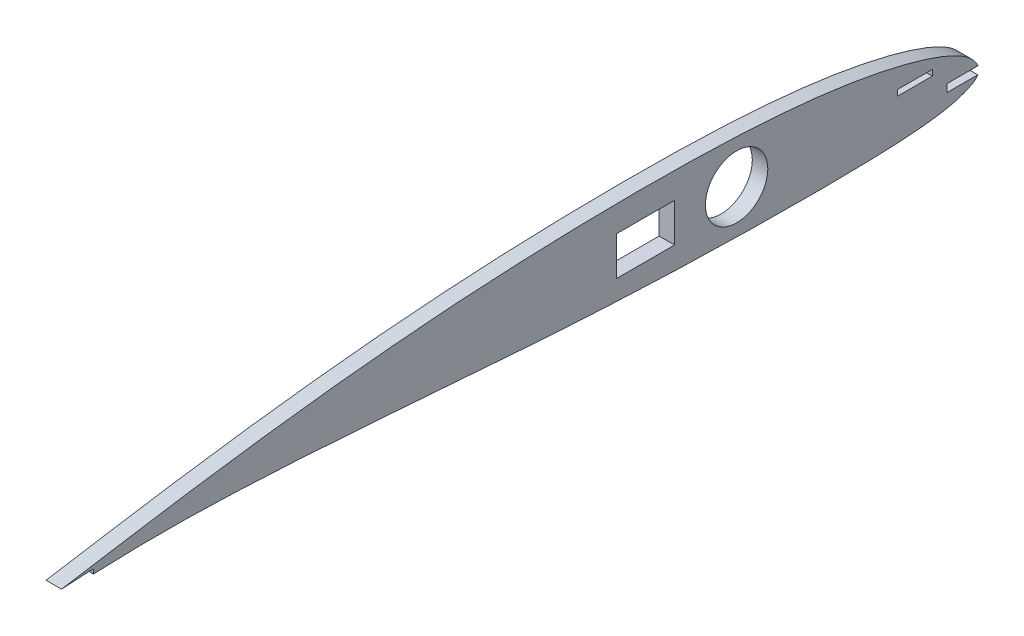
ISO-10303-21;
HEADER;
FILE_DESCRIPTION(('STEP AP214'),'2;1');
FILE_NAME('part.step','',(''),(''),'','','');
FILE_SCHEMA(('AUTOMOTIVE_DESIGN { 1 0 10303 214 1 1 1 1 }'));
ENDSEC;
DATA;
#1=APPLICATION_CONTEXT('core data for automotive mechanical design processes');
#2=APPLICATION_PROTOCOL_DEFINITION('international standard','automotive_design',2000,#1);
#3=PRODUCT_CONTEXT('',#1,'mechanical');
#4=PRODUCT('Part','Part','',(#3));
#5=PRODUCT_RELATED_PRODUCT_CATEGORY('part','',(#4));
#6=PRODUCT_DEFINITION_FORMATION('','',#4);
#7=PRODUCT_DEFINITION_CONTEXT('part definition',#1,'design');
#8=PRODUCT_DEFINITION('design','',#6,#7);
#9=PRODUCT_DEFINITION_SHAPE('','',#8);
#10=(LENGTH_UNIT() NAMED_UNIT(*) SI_UNIT(.MILLI.,.METRE.));
#11=(NAMED_UNIT(*) PLANE_ANGLE_UNIT() SI_UNIT($,.RADIAN.));
#12=(NAMED_UNIT(*) SI_UNIT($,.STERADIAN.) SOLID_ANGLE_UNIT());
#13=UNCERTAINTY_MEASURE_WITH_UNIT(LENGTH_MEASURE(1.E-05),#10,'distance_accuracy_value','');
#14=(GEOMETRIC_REPRESENTATION_CONTEXT(3) GLOBAL_UNCERTAINTY_ASSIGNED_CONTEXT((#13)) GLOBAL_UNIT_ASSIGNED_CONTEXT((#10,
#11,#12)) REPRESENTATION_CONTEXT('',''));
#15=CARTESIAN_POINT('',(0.,0.,0.));
#16=DIRECTION('',(0.,0.,1.));
#17=DIRECTION('',(1.,0.,0.));
#18=AXIS2_PLACEMENT_3D('',#15,#16,#17);
#19=CARTESIAN_POINT('',(4.,1.49711132773622,0.435092083404368));
#20=DIRECTION('',(-1.,0.,0.));
#21=DIRECTION('',(0.,0.,1.));
#22=AXIS2_PLACEMENT_3D('',#19,#20,#21);
#23=PLANE('',#22);
#24=DIRECTION('',(0.,1.,0.));
#25=VECTOR('',#24,1.);
#26=CARTESIAN_POINT('',(4.,10.0773227037384,78.4999197093942));
#27=LINE('',#26,#25);
#28=CARTESIAN_POINT('',(4.,0.0773227037384437,78.4999197093942));
#29=VERTEX_POINT('',#28);
#30=CARTESIAN_POINT('',(4.,10.0773227037384,78.4999197093942));
#31=VERTEX_POINT('',#30);
#32=EDGE_CURVE('E255',#29,#31,#27,.T.);
#33=ORIENTED_EDGE('',*,*,#32,.F.);
#34=DIRECTION('',(0.,0.,-1.));
#35=VECTOR('',#34,1.);
#36=CARTESIAN_POINT('',(4.,0.0773227037384437,78.4999197093942));
#37=LINE('',#36,#35);
#38=CARTESIAN_POINT('',(4.,0.0773227037384437,93.4999197093942));
#39=VERTEX_POINT('',#38);
#40=EDGE_CURVE('E266',#39,#29,#37,.T.);
#41=ORIENTED_EDGE('',*,*,#40,.F.);
#42=DIRECTION('',(0.,-1.,0.));
#43=VECTOR('',#42,1.);
#44=CARTESIAN_POINT('',(4.,10.0773227037384,93.4999197093942));
#45=LINE('',#44,#43);
#46=CARTESIAN_POINT('',(4.,10.0773227037384,93.4999197093942));
#47=VERTEX_POINT('',#46);
#48=EDGE_CURVE('E262',#47,#39,#45,.T.);
#49=ORIENTED_EDGE('',*,*,#48,.F.);
#50=DIRECTION('',(0.,0.,1.));
#51=VECTOR('',#50,1.);
#52=CARTESIAN_POINT('',(4.,10.0773227037384,78.4999197093942));
#53=LINE('',#52,#51);
#54=EDGE_CURVE('E258',#31,#47,#53,.T.);
#55=ORIENTED_EDGE('',*,*,#54,.F.);
#56=EDGE_LOOP('',(#33,#41,#49,#55));
#57=FACE_BOUND('',#56,.T.);
#58=CARTESIAN_POINT('',(4.,5.07732270373844,62.4999197093942));
#59=DIRECTION('',(1.,0.,0.));
#60=DIRECTION('',(0.,0.,-1.));
#61=AXIS2_PLACEMENT_3D('',#58,#59,#60);
#62=CIRCLE('',#61,8.05);
#63=CARTESIAN_POINT('',(4.,5.07732270373844,54.4499197093942));
#64=VERTEX_POINT('',#63);
#65=EDGE_CURVE('E203',#64,#64,#62,.T.);
#66=ORIENTED_EDGE('',*,*,#65,.F.);
#67=EDGE_LOOP('',(#66));
#68=FACE_BOUND('',#67,.T.);
#69=DIRECTION('',(0.,0.,1.));
#70=VECTOR('',#69,1.);
#71=CARTESIAN_POINT('',(4.,4.57732270373843,21.));
#72=LINE('',#71,#70);
#73=CARTESIAN_POINT('',(4.,4.57732270373843,12.));
#74=VERTEX_POINT('',#73);
#75=CARTESIAN_POINT('',(4.,4.57732270373843,21.));
#76=VERTEX_POINT('',#75);
#77=EDGE_CURVE('E335',#74,#76,#72,.T.);
#78=ORIENTED_EDGE('',*,*,#77,.T.);
#79=DIRECTION('',(0.,1.,0.));
#80=VECTOR('',#79,1.);
#81=CARTESIAN_POINT('',(4.,6.07732270373843,21.));
#82=LINE('',#81,#80);
#83=CARTESIAN_POINT('',(4.,6.07732270373843,21.));
#84=VERTEX_POINT('',#83);
#85=EDGE_CURVE('E338',#76,#84,#82,.T.);
#86=ORIENTED_EDGE('',*,*,#85,.T.);
#87=DIRECTION('',(0.,0.,-1.));
#88=VECTOR('',#87,1.);
#89=CARTESIAN_POINT('',(4.,6.07732270373843,21.));
#90=LINE('',#89,#88);
#91=CARTESIAN_POINT('',(4.,6.07732270373843,12.));
#92=VERTEX_POINT('',#91);
#93=EDGE_CURVE('E348',#84,#92,#90,.T.);
#94=ORIENTED_EDGE('',*,*,#93,.T.);
#95=DIRECTION('',(0.,-1.,0.));
#96=VECTOR('',#95,1.);
#97=CARTESIAN_POINT('',(4.,6.07732270373843,12.));
#98=LINE('',#97,#96);
#99=EDGE_CURVE('E88',#92,#74,#98,.T.);
#100=ORIENTED_EDGE('',*,*,#99,.T.);
#101=EDGE_LOOP('',(#78,#86,#94,#100));
#102=FACE_BOUND('',#101,.T.);
#103=DIRECTION('',(0.,0.998451108391885,0.0556361766390854));
#104=VECTOR('',#103,1.);
#105=CARTESIAN_POINT('',(4.,1.52622001669951,228.477241343692));
#106=LINE('',#105,#104);
#107=CARTESIAN_POINT('',(4.,1.52622001669951,228.477241343692));
#108=VERTEX_POINT('',#107);
#109=CARTESIAN_POINT('',(4.,2.72436134676977,228.544004755659));
#110=VERTEX_POINT('',#109);
#111=EDGE_CURVE('E194',#108,#110,#106,.T.);
#112=ORIENTED_EDGE('',*,*,#111,.F.);
#113=CARTESIAN_POINT('',(4.,0.,250.));
#114=CARTESIAN_POINT('',(4.,-0.0080427959719715,250.000228293678));
#115=CARTESIAN_POINT('',(4.,0.172375657967406,248.284955515532));
#116=CARTESIAN_POINT('',(4.,0.308690014795419,246.518112419387));
#117=CARTESIAN_POINT('',(4.,0.685693593852336,242.189387343398));
#118=CARTESIAN_POINT('',(4.,1.07410152891603,236.806461263496));
#119=CARTESIAN_POINT('',(4.,1.49731723995003,229.680385951639));
#120=CARTESIAN_POINT('',(4.,1.8232186026768,221.18415869828));
#121=CARTESIAN_POINT('',(4.,1.96762610068065,211.337618207726));
#122=CARTESIAN_POINT('',(4.,1.83322105638369,200.371188527109));
#123=CARTESIAN_POINT('',(4.,1.38960528984164,188.499913622482));
#124=CARTESIAN_POINT('',(4.,0.706014078000893,175.953687417433));
#125=CARTESIAN_POINT('',(4.,-0.160208641561513,162.931424917666));
#126=CARTESIAN_POINT('',(4.,-1.14801632724376,149.615771743617));
#127=CARTESIAN_POINT('',(4.,-2.19092490983926,136.176354994724));
#128=CARTESIAN_POINT('',(4.,-3.21958397917046,122.767140548026));
#129=CARTESIAN_POINT('',(4.,-4.15274312671142,109.520053587455));
#130=CARTESIAN_POINT('',(4.,-4.93856436487493,96.5460959745437));
#131=CARTESIAN_POINT('',(4.,-5.53683070268675,83.9408193016427));
#132=CARTESIAN_POINT('',(4.,-5.94764820461108,71.8018392906514));
#133=CARTESIAN_POINT('',(4.,-6.21845093878312,60.2452560030716));
#134=CARTESIAN_POINT('',(4.,-6.35536975583973,49.3987328907547));
#135=CARTESIAN_POINT('',(4.,-6.38138796281789,39.3972261942655));
#136=CARTESIAN_POINT('',(4.,-6.26504923032313,30.3619348419668));
#137=CARTESIAN_POINT('',(4.,-6.01216491688521,22.4121811031587));
#138=CARTESIAN_POINT('',(4.,-5.59743390072595,15.6262272306516));
#139=CARTESIAN_POINT('',(4.,-4.92870657935606,10.0719075109048));
#140=CARTESIAN_POINT('',(4.,-4.04044698146404,5.69769261214423));
#141=CARTESIAN_POINT('',(4.,-2.8657529844069,2.62532063874475));
#142=CARTESIAN_POINT('',(4.,-1.7115284699546,0.494884225045661));
#143=CARTESIAN_POINT('',(4.,-0.410454230626488,-0.0213125491030087));
#144=CARTESIAN_POINT('',(4.,0.792659826704065,0.0311691995850224));
#145=CARTESIAN_POINT('',(4.,2.30568433693192,0.812599241892923));
#146=CARTESIAN_POINT('',(4.,4.23835242447377,2.72886351673443));
#147=CARTESIAN_POINT('',(4.,6.11817212106947,5.76990724125498));
#148=CARTESIAN_POINT('',(4.,7.91359420170391,9.88094280419771));
#149=CARTESIAN_POINT('',(4.,9.64131817838287,15.0749304677094));
#150=CARTESIAN_POINT('',(4.,11.2838964878058,21.2987522216172));
#151=CARTESIAN_POINT('',(4.,12.7883817585812,28.4971721202648));
#152=CARTESIAN_POINT('',(4.,14.0978349081275,36.6073734062479));
#153=CARTESIAN_POINT('',(4.,15.1594290171638,45.573028440303));
#154=CARTESIAN_POINT('',(4.,15.9609039979753,55.3329100744701));
#155=CARTESIAN_POINT('',(4.,16.4940697383882,65.8165364983871));
#156=CARTESIAN_POINT('',(4.,16.7919897051422,76.9313762604552));
#157=CARTESIAN_POINT('',(4.,16.864754130909,88.5669490281142));
#158=CARTESIAN_POINT('',(4.,16.7267152914356,100.596999885542));
#159=CARTESIAN_POINT('',(4.,16.3833850637257,112.888825982424));
#160=CARTESIAN_POINT('',(4.,15.825573666627,125.31161581915));
#161=CARTESIAN_POINT('',(4.,15.0523318700684,137.743791097076));
#162=CARTESIAN_POINT('',(4.,14.0593390742259,150.072384382085));
#163=CARTESIAN_POINT('',(4.,12.8815869860292,162.191375055682));
#164=CARTESIAN_POINT('',(4.,11.5492803460744,173.989074322246));
#165=CARTESIAN_POINT('',(4.,10.1162497290333,185.35236444642));
#166=CARTESIAN_POINT('',(4.,8.63237912523508,196.163081697706));
#167=CARTESIAN_POINT('',(4.,7.13151388385034,206.300441402258));
#168=CARTESIAN_POINT('',(4.,5.73122176805054,215.560350587015));
#169=CARTESIAN_POINT('',(4.,4.29329512716244,223.97715704258));
#170=CARTESIAN_POINT('',(4.,3.1818088737293,231.363413336396));
#171=CARTESIAN_POINT('',(4.,2.09894241729889,237.746440904332));
#172=CARTESIAN_POINT('',(4.,1.2458619166603,242.622069365861));
#173=CARTESIAN_POINT('',(4.,0.552864946230777,246.64452933247));
#174=CARTESIAN_POINT('',(4.,0.246216764640028,248.328398440367));
#175=CARTESIAN_POINT('',(4.,0.00797737724443801,249.999773563223));
#176=CARTESIAN_POINT('',(4.,0.,250.));
#177=B_SPLINE_CURVE_WITH_KNOTS('',3,(#113,#114,#115,#116,#117,#118,#119,#120,#121,#122,#123,
#124,#125,#126,#127,#128,#129,#130,#131,#132,#133,#134,#135,#136,#137,#138,#139,#140,#141,#142,
#143,#144,#145,#146,#147,#148,#149,#150,#151,#152,#153,#154,#155,#156,#157,#158,#159,#160,#161,
#162,#163,#164,#165,#166,#167,#168,#169,#170,#171,#172,#173,#174,#175,#176),.UNSPECIFIED.,.T.,
.F.,(4,1,1,1,1,1,1,1,1,1,1,1,1,1,1,1,1,1,1,1,1,1,1,1,1,1,1,1,1,1,1,1,1,1,1,1,1,1,1,1,1,1,1,1,1,
1,1,1,1,1,1,1,1,1,1,1,1,1,1,1,1,4),(0.,0.00158888881614516,0.00632921783555629,
0.0142024564897436,0.0251728077530557,0.0391734833267743,0.0560606311759249,0.0755789238487882,
0.0973636066296903,0.120926258366677,0.145825281006277,0.171670911815127,0.198108536705041,
0.22479018357162,0.25139057978404,0.277643490654311,0.303326750051388,0.328257458029316,
0.352272548115194,0.375156061746876,0.396620664402003,0.416422729294005,0.434304420097656,
0.450054679859308,0.463465465082325,0.474478994238096,0.483169222153171,0.489678354497499,
0.494104066315722,0.496910015324886,0.497289784891853,0.501214273282496,0.506457950332762,
0.51335695674223,0.522168631834455,0.53296596992453,0.545689209241574,0.56022077890382,
0.57643892310517,0.594258689005965,0.613600244568652,0.634342385932902,0.656331109263004,
0.679351893859712,0.703152302846811,0.727478208080039,0.7520707394079,0.776691163534608,
0.801140183976245,0.825214386971546,0.848697423570622,0.871352857669295,0.892947448931157,
0.913230871058069,0.931955467148994,0.94834206907442,0.963693004275676,0.976235918239566,
0.986320058750392,0.993788799349345,0.998424034933867,1.),.UNSPECIFIED.);
#178=CARTESIAN_POINT('',(4.,-1.00000653516622,0.266538474913965));
#179=VERTEX_POINT('',#178);
#180=EDGE_CURVE('E197',#108,#179,#177,.T.);
#181=ORIENTED_EDGE('',*,*,#180,.T.);
#182=DIRECTION('',(0.,0.,1.));
#183=VECTOR('',#182,1.);
#184=CARTESIAN_POINT('',(4.,-1.00000652295607,-8.02951190162347E-05));
#185=LINE('',#184,#183);
#186=CARTESIAN_POINT('',(4.,-1.00000652295607,8.19991970488098));
#187=VERTEX_POINT('',#186);
#188=EDGE_CURVE('E237',#179,#187,#185,.T.);
#189=ORIENTED_EDGE('',*,*,#188,.T.);
#190=DIRECTION('',(0.,1.,0.));
#191=VECTOR('',#190,1.);
#192=CARTESIAN_POINT('',(4.,0.999993477043933,8.19991970488098));
#193=LINE('',#192,#191);
#194=CARTESIAN_POINT('',(4.,0.999993477043933,8.19991970488098));
#195=VERTEX_POINT('',#194);
#196=EDGE_CURVE('E227',#187,#195,#193,.T.);
#197=ORIENTED_EDGE('',*,*,#196,.T.);
#198=DIRECTION('',(0.,0.,-1.));
#199=VECTOR('',#198,1.);
#200=CARTESIAN_POINT('',(4.,0.999993477043928,-8.0295119016847E-05));
#201=LINE('',#200,#199);
#202=CARTESIAN_POINT('',(4.,0.999993477043928,0.201514144687533));
#203=VERTEX_POINT('',#202);
#204=EDGE_CURVE('E224',#195,#203,#201,.T.);
#205=ORIENTED_EDGE('',*,*,#204,.T.);
#206=CARTESIAN_POINT('',(4.,2.26814469832928,236.731303844473));
#207=VERTEX_POINT('',#206);
#208=EDGE_CURVE('E202',#203,#207,#177,.T.);
#209=ORIENTED_EDGE('',*,*,#208,.T.);
#210=DIRECTION('',(0.,-0.0556361766390854,0.998451108391885));
#211=VECTOR('',#210,1.);
#212=CARTESIAN_POINT('',(4.,2.72436134676977,228.544004755659));
#213=LINE('',#212,#211);
#214=EDGE_CURVE('E178',#110,#207,#213,.T.);
#215=ORIENTED_EDGE('',*,*,#214,.F.);
#216=EDGE_LOOP('',(#112,#181,#189,#197,#205,#209,#215));
#217=FACE_BOUND('',#216,.T.);
#218=ADVANCED_FACE('F63',(#57,#68,#102,#217),#23,.F.);
#219=CARTESIAN_POINT('',(0.,1.49711132773622,0.435092083404368));
#220=DIRECTION('',(-1.,0.,0.));
#221=DIRECTION('',(0.,0.,1.));
#222=AXIS2_PLACEMENT_3D('',#219,#220,#221);
#223=PLANE('',#222);
#224=DIRECTION('',(0.,1.,0.));
#225=VECTOR('',#224,1.);
#226=CARTESIAN_POINT('',(0.,6.07732270373843,21.));
#227=LINE('',#226,#225);
#228=CARTESIAN_POINT('',(0.,4.57732270373843,21.));
#229=VERTEX_POINT('',#228);
#230=CARTESIAN_POINT('',(0.,6.07732270373843,21.));
#231=VERTEX_POINT('',#230);
#232=EDGE_CURVE('E184',#229,#231,#227,.T.);
#233=ORIENTED_EDGE('',*,*,#232,.F.);
#234=DIRECTION('',(0.,0.,1.));
#235=VECTOR('',#234,1.);
#236=CARTESIAN_POINT('',(0.,4.57732270373843,21.));
#237=LINE('',#236,#235);
#238=CARTESIAN_POINT('',(0.,4.57732270373843,12.));
#239=VERTEX_POINT('',#238);
#240=EDGE_CURVE('E362',#239,#229,#237,.T.);
#241=ORIENTED_EDGE('',*,*,#240,.F.);
#242=DIRECTION('',(0.,-1.,0.));
#243=VECTOR('',#242,1.);
#244=CARTESIAN_POINT('',(0.,6.07732270373843,12.));
#245=LINE('',#244,#243);
#246=CARTESIAN_POINT('',(0.,6.07732270373843,12.));
#247=VERTEX_POINT('',#246);
#248=EDGE_CURVE('E358',#247,#239,#245,.T.);
#249=ORIENTED_EDGE('',*,*,#248,.F.);
#250=DIRECTION('',(0.,0.,-1.));
#251=VECTOR('',#250,1.);
#252=CARTESIAN_POINT('',(0.,6.07732270373843,21.));
#253=LINE('',#252,#251);
#254=EDGE_CURVE('E354',#231,#247,#253,.T.);
#255=ORIENTED_EDGE('',*,*,#254,.F.);
#256=EDGE_LOOP('',(#233,#241,#249,#255));
#257=FACE_BOUND('',#256,.T.);
#258=CARTESIAN_POINT('',(0.,5.07732270373844,62.4999197093942));
#259=DIRECTION('',(1.,0.,0.));
#260=DIRECTION('',(0.,0.,-1.));
#261=AXIS2_PLACEMENT_3D('',#258,#259,#260);
#262=CIRCLE('',#261,8.05);
#263=CARTESIAN_POINT('',(0.,5.07732270373844,54.4499197093942));
#264=VERTEX_POINT('',#263);
#265=EDGE_CURVE('E297',#264,#264,#262,.T.);
#266=ORIENTED_EDGE('',*,*,#265,.T.);
#267=EDGE_LOOP('',(#266));
#268=FACE_BOUND('',#267,.T.);
#269=DIRECTION('',(0.,0.,-1.));
#270=VECTOR('',#269,1.);
#271=CARTESIAN_POINT('',(0.,0.0773227037384437,78.4999197093942));
#272=LINE('',#271,#270);
#273=CARTESIAN_POINT('',(0.,0.0773227037384437,93.4999197093942));
#274=VERTEX_POINT('',#273);
#275=CARTESIAN_POINT('',(0.,0.0773227037384437,78.4999197093942));
#276=VERTEX_POINT('',#275);
#277=EDGE_CURVE('E259',#274,#276,#272,.T.);
#278=ORIENTED_EDGE('',*,*,#277,.T.);
#279=DIRECTION('',(0.,1.,0.));
#280=VECTOR('',#279,1.);
#281=CARTESIAN_POINT('',(0.,10.0773227037384,78.4999197093942));
#282=LINE('',#281,#280);
#283=CARTESIAN_POINT('',(0.,10.0773227037384,78.4999197093942));
#284=VERTEX_POINT('',#283);
#285=EDGE_CURVE('E253',#276,#284,#282,.T.);
#286=ORIENTED_EDGE('',*,*,#285,.T.);
#287=DIRECTION('',(0.,0.,1.));
#288=VECTOR('',#287,1.);
#289=CARTESIAN_POINT('',(0.,10.0773227037384,78.4999197093942));
#290=LINE('',#289,#288);
#291=CARTESIAN_POINT('',(0.,10.0773227037384,93.4999197093942));
#292=VERTEX_POINT('',#291);
#293=EDGE_CURVE('E273',#284,#292,#290,.T.);
#294=ORIENTED_EDGE('',*,*,#293,.T.);
#295=DIRECTION('',(0.,-1.,0.));
#296=VECTOR('',#295,1.);
#297=CARTESIAN_POINT('',(0.,10.0773227037384,93.4999197093942));
#298=LINE('',#297,#296);
#299=EDGE_CURVE('E277',#292,#274,#298,.T.);
#300=ORIENTED_EDGE('',*,*,#299,.T.);
#301=EDGE_LOOP('',(#278,#286,#294,#300));
#302=FACE_BOUND('',#301,.T.);
#303=CARTESIAN_POINT('',(0.,0.,250.));
#304=CARTESIAN_POINT('',(0.,-0.0080427959719715,250.000228293678));
#305=CARTESIAN_POINT('',(0.,0.172375657967406,248.284955515532));
#306=CARTESIAN_POINT('',(0.,0.308690014795419,246.518112419387));
#307=CARTESIAN_POINT('',(0.,0.685693593852336,242.189387343398));
#308=CARTESIAN_POINT('',(0.,1.07410152891603,236.806461263496));
#309=CARTESIAN_POINT('',(0.,1.49731723995003,229.680385951639));
#310=CARTESIAN_POINT('',(0.,1.8232186026768,221.18415869828));
#311=CARTESIAN_POINT('',(0.,1.96762610068065,211.337618207726));
#312=CARTESIAN_POINT('',(0.,1.83322105638369,200.371188527109));
#313=CARTESIAN_POINT('',(0.,1.38960528984164,188.499913622482));
#314=CARTESIAN_POINT('',(0.,0.706014078000893,175.953687417433));
#315=CARTESIAN_POINT('',(0.,-0.160208641561513,162.931424917666));
#316=CARTESIAN_POINT('',(0.,-1.14801632724376,149.615771743617));
#317=CARTESIAN_POINT('',(0.,-2.19092490983926,136.176354994724));
#318=CARTESIAN_POINT('',(0.,-3.21958397917046,122.767140548026));
#319=CARTESIAN_POINT('',(0.,-4.15274312671142,109.520053587455));
#320=CARTESIAN_POINT('',(0.,-4.93856436487493,96.5460959745437));
#321=CARTESIAN_POINT('',(0.,-5.53683070268675,83.9408193016427));
#322=CARTESIAN_POINT('',(0.,-5.94764820461108,71.8018392906514));
#323=CARTESIAN_POINT('',(0.,-6.21845093878312,60.2452560030716));
#324=CARTESIAN_POINT('',(0.,-6.35536975583973,49.3987328907547));
#325=CARTESIAN_POINT('',(0.,-6.38138796281789,39.3972261942655));
#326=CARTESIAN_POINT('',(0.,-6.26504923032313,30.3619348419668));
#327=CARTESIAN_POINT('',(0.,-6.01216491688521,22.4121811031587));
#328=CARTESIAN_POINT('',(0.,-5.59743390072595,15.6262272306516));
#329=CARTESIAN_POINT('',(0.,-4.92870657935606,10.0719075109048));
#330=CARTESIAN_POINT('',(0.,-4.04044698146404,5.69769261214423));
#331=CARTESIAN_POINT('',(0.,-2.8657529844069,2.62532063874475));
#332=CARTESIAN_POINT('',(0.,-1.7115284699546,0.494884225045661));
#333=CARTESIAN_POINT('',(0.,-0.410454230626488,-0.0213125491030087));
#334=CARTESIAN_POINT('',(0.,0.792659826704065,0.0311691995850224));
#335=CARTESIAN_POINT('',(0.,2.30568433693192,0.812599241892923));
#336=CARTESIAN_POINT('',(0.,4.23835242447377,2.72886351673443));
#337=CARTESIAN_POINT('',(0.,6.11817212106947,5.76990724125498));
#338=CARTESIAN_POINT('',(0.,7.91359420170391,9.88094280419771));
#339=CARTESIAN_POINT('',(0.,9.64131817838287,15.0749304677094));
#340=CARTESIAN_POINT('',(0.,11.2838964878058,21.2987522216172));
#341=CARTESIAN_POINT('',(0.,12.7883817585812,28.4971721202648));
#342=CARTESIAN_POINT('',(0.,14.0978349081275,36.6073734062479));
#343=CARTESIAN_POINT('',(0.,15.1594290171638,45.573028440303));
#344=CARTESIAN_POINT('',(0.,15.9609039979753,55.3329100744701));
#345=CARTESIAN_POINT('',(0.,16.4940697383882,65.8165364983871));
#346=CARTESIAN_POINT('',(0.,16.7919897051422,76.9313762604552));
#347=CARTESIAN_POINT('',(0.,16.864754130909,88.5669490281142));
#348=CARTESIAN_POINT('',(0.,16.7267152914356,100.596999885542));
#349=CARTESIAN_POINT('',(0.,16.3833850637257,112.888825982424));
#350=CARTESIAN_POINT('',(0.,15.825573666627,125.31161581915));
#351=CARTESIAN_POINT('',(0.,15.0523318700684,137.743791097076));
#352=CARTESIAN_POINT('',(0.,14.0593390742259,150.072384382085));
#353=CARTESIAN_POINT('',(0.,12.8815869860292,162.191375055682));
#354=CARTESIAN_POINT('',(0.,11.5492803460744,173.989074322246));
#355=CARTESIAN_POINT('',(0.,10.1162497290333,185.35236444642));
#356=CARTESIAN_POINT('',(0.,8.63237912523508,196.163081697706));
#357=CARTESIAN_POINT('',(0.,7.13151388385034,206.300441402258));
#358=CARTESIAN_POINT('',(0.,5.73122176805054,215.560350587015));
#359=CARTESIAN_POINT('',(0.,4.29329512716244,223.97715704258));
#360=CARTESIAN_POINT('',(0.,3.1818088737293,231.363413336396));
#361=CARTESIAN_POINT('',(0.,2.09894241729889,237.746440904332));
#362=CARTESIAN_POINT('',(0.,1.2458619166603,242.622069365861));
#363=CARTESIAN_POINT('',(0.,0.552864946230777,246.64452933247));
#364=CARTESIAN_POINT('',(0.,0.246216764640028,248.328398440367));
#365=CARTESIAN_POINT('',(0.,0.00797737724443801,249.999773563223));
#366=CARTESIAN_POINT('',(0.,0.,250.));
#367=B_SPLINE_CURVE_WITH_KNOTS('',3,(#303,#304,#305,#306,#307,#308,#309,#310,#311,#312,#313,
#314,#315,#316,#317,#318,#319,#320,#321,#322,#323,#324,#325,#326,#327,#328,#329,#330,#331,#332,
#333,#334,#335,#336,#337,#338,#339,#340,#341,#342,#343,#344,#345,#346,#347,#348,#349,#350,#351,
#352,#353,#354,#355,#356,#357,#358,#359,#360,#361,#362,#363,#364,#365,#366),.UNSPECIFIED.,.T.,
.F.,(4,1,1,1,1,1,1,1,1,1,1,1,1,1,1,1,1,1,1,1,1,1,1,1,1,1,1,1,1,1,1,1,1,1,1,1,1,1,1,1,1,1,1,1,1,
1,1,1,1,1,1,1,1,1,1,1,1,1,1,1,1,4),(0.,0.00158888881614516,0.00632921783555629,
0.0142024564897436,0.0251728077530557,0.0391734833267743,0.0560606311759249,0.0755789238487882,
0.0973636066296903,0.120926258366677,0.145825281006277,0.171670911815127,0.198108536705041,
0.22479018357162,0.25139057978404,0.277643490654311,0.303326750051388,0.328257458029316,
0.352272548115194,0.375156061746876,0.396620664402003,0.416422729294005,0.434304420097656,
0.450054679859308,0.463465465082325,0.474478994238096,0.483169222153171,0.489678354497499,
0.494104066315722,0.496910015324886,0.497289784891853,0.501214273282496,0.506457950332762,
0.51335695674223,0.522168631834455,0.53296596992453,0.545689209241574,0.56022077890382,
0.57643892310517,0.594258689005965,0.613600244568652,0.634342385932902,0.656331109263004,
0.679351893859712,0.703152302846811,0.727478208080039,0.7520707394079,0.776691163534608,
0.801140183976245,0.825214386971546,0.848697423570622,0.871352857669295,0.892947448931157,
0.913230871058069,0.931955467148994,0.94834206907442,0.963693004275676,0.976235918239566,
0.986320058750392,0.993788799349345,0.998424034933867,1.),.UNSPECIFIED.);
#368=CARTESIAN_POINT('',(0.,1.52622001669949,228.477241343693));
#369=VERTEX_POINT('',#368);
#370=CARTESIAN_POINT('',(0.,-1.00000652295607,0.266538474914019));
#371=VERTEX_POINT('',#370);
#372=EDGE_CURVE('E198',#369,#371,#367,.T.);
#373=ORIENTED_EDGE('',*,*,#372,.F.);
#374=DIRECTION('',(0.,0.998451108391885,0.0556361766390854));
#375=VECTOR('',#374,1.);
#376=CARTESIAN_POINT('',(0.,1.52622001669951,228.477241343692));
#377=LINE('',#376,#375);
#378=CARTESIAN_POINT('',(0.,2.72436134676977,228.544004755659));
#379=VERTEX_POINT('',#378);
#380=EDGE_CURVE('E80',#369,#379,#377,.T.);
#381=ORIENTED_EDGE('',*,*,#380,.T.);
#382=DIRECTION('',(0.,-0.0556361766390854,0.998451108391885));
#383=VECTOR('',#382,1.);
#384=CARTESIAN_POINT('',(0.,2.72436134676977,228.544004755659));
#385=LINE('',#384,#383);
#386=CARTESIAN_POINT('',(0.,2.26814469832928,236.731303844473));
#387=VERTEX_POINT('',#386);
#388=EDGE_CURVE('E176',#379,#387,#385,.T.);
#389=ORIENTED_EDGE('',*,*,#388,.T.);
#390=CARTESIAN_POINT('',(0.,0.999993477043928,0.201514144687533));
#391=VERTEX_POINT('',#390);
#392=EDGE_CURVE('E192',#391,#387,#367,.T.);
#393=ORIENTED_EDGE('',*,*,#392,.F.);
#394=DIRECTION('',(0.,0.,-1.));
#395=VECTOR('',#394,1.);
#396=CARTESIAN_POINT('',(0.,0.999993477043928,-8.0295119016847E-05));
#397=LINE('',#396,#395);
#398=CARTESIAN_POINT('',(0.,0.999993477043933,8.19991970488098));
#399=VERTEX_POINT('',#398);
#400=EDGE_CURVE('E249',#399,#391,#397,.T.);
#401=ORIENTED_EDGE('',*,*,#400,.F.);
#402=DIRECTION('',(0.,1.,0.));
#403=VECTOR('',#402,1.);
#404=CARTESIAN_POINT('',(0.,0.999993477043933,8.19991970488098));
#405=LINE('',#404,#403);
#406=CARTESIAN_POINT('',(0.,-1.00000652295607,8.19991970488098));
#407=VERTEX_POINT('',#406);
#408=EDGE_CURVE('E244',#407,#399,#405,.T.);
#409=ORIENTED_EDGE('',*,*,#408,.F.);
#410=DIRECTION('',(0.,0.,1.));
#411=VECTOR('',#410,1.);
#412=CARTESIAN_POINT('',(0.,-1.00000652295607,-8.02951190162347E-05));
#413=LINE('',#412,#411);
#414=EDGE_CURVE('E241',#371,#407,#413,.T.);
#415=ORIENTED_EDGE('',*,*,#414,.F.);
#416=EDGE_LOOP('',(#373,#381,#389,#393,#401,#409,#415));
#417=FACE_BOUND('',#416,.T.);
#418=ADVANCED_FACE('F190',(#257,#268,#302,#417),#223,.T.);
#419=DIRECTION('',(-1.,0.,0.));
#420=VECTOR('',#419,1.);
#421=SURFACE_OF_LINEAR_EXTRUSION('',#177,#420);
#422=DIRECTION('',(-1.,0.,0.));
#423=VECTOR('',#422,1.);
#424=CARTESIAN_POINT('',(4.,2.26814469832928,236.731303844473));
#425=LINE('',#424,#423);
#426=EDGE_CURVE('E172',#207,#387,#425,.T.);
#427=ORIENTED_EDGE('',*,*,#426,.F.);
#428=ORIENTED_EDGE('',*,*,#208,.F.);
#429=DIRECTION('',(-1.,0.,0.));
#430=VECTOR('',#429,1.);
#431=CARTESIAN_POINT('',(4.,0.999993477043937,0.201514159716749));
#432=LINE('',#431,#430);
#433=EDGE_CURVE('E12',#203,#391,#432,.T.);
#434=ORIENTED_EDGE('',*,*,#433,.T.);
#435=ORIENTED_EDGE('',*,*,#392,.T.);
#436=EDGE_LOOP('',(#427,#428,#434,#435));
#437=FACE_BOUND('',#436,.T.);
#438=ADVANCED_FACE('F65',(#437),#421,.F.);
#439=DIRECTION('',(-1.,0.,0.));
#440=VECTOR('',#439,1.);
#441=CARTESIAN_POINT('',(4.,1.52622001669951,228.477241343692));
#442=LINE('',#441,#440);
#443=EDGE_CURVE('E185',#108,#369,#442,.T.);
#444=ORIENTED_EDGE('',*,*,#443,.T.);
#445=ORIENTED_EDGE('',*,*,#372,.T.);
#446=DIRECTION('',(-1.,0.,0.));
#447=VECTOR('',#446,1.);
#448=CARTESIAN_POINT('',(4.,-1.00000652295608,0.26653846850589));
#449=LINE('',#448,#447);
#450=EDGE_CURVE('E73',#371,#179,#449,.F.);
#451=ORIENTED_EDGE('',*,*,#450,.T.);
#452=ORIENTED_EDGE('',*,*,#180,.F.);
#453=EDGE_LOOP('',(#444,#445,#451,#452));
#454=FACE_BOUND('',#453,.T.);
#455=ADVANCED_FACE('F309',(#454),#421,.F.);
#456=CARTESIAN_POINT('',(4.,5.07732270373844,62.4999197093942));
#457=DIRECTION('',(-1.,0.,0.));
#458=DIRECTION('',(0.,0.,1.));
#459=AXIS2_PLACEMENT_3D('',#456,#457,#458);
#460=CYLINDRICAL_SURFACE('',#459,8.05);
#461=ORIENTED_EDGE('',*,*,#65,.T.);
#462=EDGE_LOOP('',(#461));
#463=FACE_BOUND('',#462,.T.);
#464=ORIENTED_EDGE('',*,*,#265,.F.);
#465=EDGE_LOOP('',(#464));
#466=FACE_BOUND('',#465,.T.);
#467=ADVANCED_FACE('F306',(#463,#466),#460,.F.);
#468=CARTESIAN_POINT('',(4.,10.0773227037384,78.4999197093942));
#469=DIRECTION('',(0.,0.,1.));
#470=DIRECTION('',(1.,0.,0.));
#471=AXIS2_PLACEMENT_3D('',#468,#469,#470);
#472=PLANE('',#471);
#473=ORIENTED_EDGE('',*,*,#285,.F.);
#474=DIRECTION('',(-1.,0.,0.));
#475=VECTOR('',#474,1.);
#476=CARTESIAN_POINT('',(4.,0.0773227037384437,78.4999197093942));
#477=LINE('',#476,#475);
#478=EDGE_CURVE('E269',#29,#276,#477,.T.);
#479=ORIENTED_EDGE('',*,*,#478,.F.);
#480=ORIENTED_EDGE('',*,*,#32,.T.);
#481=DIRECTION('',(-1.,0.,0.));
#482=VECTOR('',#481,1.);
#483=CARTESIAN_POINT('',(4.,10.0773227037384,78.4999197093942));
#484=LINE('',#483,#482);
#485=EDGE_CURVE('E293',#31,#284,#484,.T.);
#486=ORIENTED_EDGE('',*,*,#485,.T.);
#487=EDGE_LOOP('',(#473,#479,#480,#486));
#488=FACE_BOUND('',#487,.T.);
#489=ADVANCED_FACE('F308',(#488),#472,.T.);
#490=CARTESIAN_POINT('',(4.,10.0773227037384,78.4999197093942));
#491=DIRECTION('',(0.,-1.,0.));
#492=DIRECTION('',(0.,0.,-1.));
#493=AXIS2_PLACEMENT_3D('',#490,#491,#492);
#494=PLANE('',#493);
#495=ORIENTED_EDGE('',*,*,#293,.F.);
#496=ORIENTED_EDGE('',*,*,#485,.F.);
#497=ORIENTED_EDGE('',*,*,#54,.T.);
#498=DIRECTION('',(-1.,0.,0.));
#499=VECTOR('',#498,1.);
#500=CARTESIAN_POINT('',(4.,10.0773227037384,93.4999197093942));
#501=LINE('',#500,#499);
#502=EDGE_CURVE('E290',#47,#292,#501,.T.);
#503=ORIENTED_EDGE('',*,*,#502,.T.);
#504=EDGE_LOOP('',(#495,#496,#497,#503));
#505=FACE_BOUND('',#504,.T.);
#506=ADVANCED_FACE('F316',(#505),#494,.T.);
#507=CARTESIAN_POINT('',(4.,10.0773227037384,93.4999197093942));
#508=DIRECTION('',(0.,0.,-1.));
#509=DIRECTION('',(-1.,0.,0.));
#510=AXIS2_PLACEMENT_3D('',#507,#508,#509);
#511=PLANE('',#510);
#512=ORIENTED_EDGE('',*,*,#299,.F.);
#513=ORIENTED_EDGE('',*,*,#502,.F.);
#514=ORIENTED_EDGE('',*,*,#48,.T.);
#515=DIRECTION('',(-1.,0.,0.));
#516=VECTOR('',#515,1.);
#517=CARTESIAN_POINT('',(4.,0.0773227037384437,93.4999197093942));
#518=LINE('',#517,#516);
#519=EDGE_CURVE('E287',#39,#274,#518,.T.);
#520=ORIENTED_EDGE('',*,*,#519,.T.);
#521=EDGE_LOOP('',(#512,#513,#514,#520));
#522=FACE_BOUND('',#521,.T.);
#523=ADVANCED_FACE('F418',(#522),#511,.T.);
#524=CARTESIAN_POINT('',(4.,0.0773227037384437,78.4999197093942));
#525=DIRECTION('',(0.,1.,0.));
#526=DIRECTION('',(0.,0.,1.));
#527=AXIS2_PLACEMENT_3D('',#524,#525,#526);
#528=PLANE('',#527);
#529=ORIENTED_EDGE('',*,*,#277,.F.);
#530=ORIENTED_EDGE('',*,*,#519,.F.);
#531=ORIENTED_EDGE('',*,*,#40,.T.);
#532=ORIENTED_EDGE('',*,*,#478,.T.);
#533=EDGE_LOOP('',(#529,#530,#531,#532));
#534=FACE_BOUND('',#533,.T.);
#535=ADVANCED_FACE('F412',(#534),#528,.T.);
#536=CARTESIAN_POINT('',(4.,0.999993477043928,-8.0295119016847E-05));
#537=DIRECTION('',(0.,1.,0.));
#538=DIRECTION('',(0.,0.,1.));
#539=AXIS2_PLACEMENT_3D('',#536,#537,#538);
#540=PLANE('',#539);
#541=ORIENTED_EDGE('',*,*,#204,.F.);
#542=DIRECTION('',(-1.,0.,0.));
#543=VECTOR('',#542,1.);
#544=CARTESIAN_POINT('',(4.,0.999993477043933,8.19991970488098));
#545=LINE('',#544,#543);
#546=EDGE_CURVE('E235',#195,#399,#545,.T.);
#547=ORIENTED_EDGE('',*,*,#546,.T.);
#548=ORIENTED_EDGE('',*,*,#400,.T.);
#549=ORIENTED_EDGE('',*,*,#433,.F.);
#550=EDGE_LOOP('',(#541,#547,#548,#549));
#551=FACE_BOUND('',#550,.T.);
#552=ADVANCED_FACE('F380',(#551),#540,.F.);
#553=CARTESIAN_POINT('',(4.,-1.00000652295607,-8.02951190162347E-05));
#554=DIRECTION('',(0.,-1.,0.));
#555=DIRECTION('',(0.,0.,-1.));
#556=AXIS2_PLACEMENT_3D('',#553,#554,#555);
#557=PLANE('',#556);
#558=ORIENTED_EDGE('',*,*,#414,.T.);
#559=DIRECTION('',(-1.,0.,0.));
#560=VECTOR('',#559,1.);
#561=CARTESIAN_POINT('',(4.,-1.00000652295607,8.19991970488098));
#562=LINE('',#561,#560);
#563=EDGE_CURVE('E230',#187,#407,#562,.T.);
#564=ORIENTED_EDGE('',*,*,#563,.F.);
#565=ORIENTED_EDGE('',*,*,#188,.F.);
#566=ORIENTED_EDGE('',*,*,#450,.F.);
#567=EDGE_LOOP('',(#558,#564,#565,#566));
#568=FACE_BOUND('',#567,.T.);
#569=ADVANCED_FACE('F375',(#568),#557,.F.);
#570=CARTESIAN_POINT('',(4.,0.999993477043933,8.19991970488098));
#571=DIRECTION('',(0.,0.,1.));
#572=DIRECTION('',(1.,0.,0.));
#573=AXIS2_PLACEMENT_3D('',#570,#571,#572);
#574=PLANE('',#573);
#575=ORIENTED_EDGE('',*,*,#408,.T.);
#576=ORIENTED_EDGE('',*,*,#546,.F.);
#577=ORIENTED_EDGE('',*,*,#196,.F.);
#578=ORIENTED_EDGE('',*,*,#563,.T.);
#579=EDGE_LOOP('',(#575,#576,#577,#578));
#580=FACE_BOUND('',#579,.T.);
#581=ADVANCED_FACE('F379',(#580),#574,.F.);
#582=CARTESIAN_POINT('',(4.,6.07732270373843,21.));
#583=DIRECTION('',(0.,0.,1.));
#584=DIRECTION('',(0.,-1.,0.));
#585=AXIS2_PLACEMENT_3D('',#582,#583,#584);
#586=PLANE('',#585);
#587=ORIENTED_EDGE('',*,*,#232,.T.);
#588=DIRECTION('',(-1.,0.,0.));
#589=VECTOR('',#588,1.);
#590=CARTESIAN_POINT('',(4.,6.07732270373843,21.));
#591=LINE('',#590,#589);
#592=EDGE_CURVE('E341',#84,#231,#591,.T.);
#593=ORIENTED_EDGE('',*,*,#592,.F.);
#594=ORIENTED_EDGE('',*,*,#85,.F.);
#595=DIRECTION('',(-1.,0.,0.));
#596=VECTOR('',#595,1.);
#597=CARTESIAN_POINT('',(4.,4.57732270373843,21.));
#598=LINE('',#597,#596);
#599=EDGE_CURVE('E245',#76,#229,#598,.T.);
#600=ORIENTED_EDGE('',*,*,#599,.T.);
#601=EDGE_LOOP('',(#587,#593,#594,#600));
#602=FACE_BOUND('',#601,.T.);
#603=ADVANCED_FACE('F399',(#602),#586,.F.);
#604=CARTESIAN_POINT('',(4.,4.57732270373843,21.));
#605=DIRECTION('',(0.,-1.,0.));
#606=DIRECTION('',(0.,0.,-1.));
#607=AXIS2_PLACEMENT_3D('',#604,#605,#606);
#608=PLANE('',#607);
#609=ORIENTED_EDGE('',*,*,#240,.T.);
#610=ORIENTED_EDGE('',*,*,#599,.F.);
#611=ORIENTED_EDGE('',*,*,#77,.F.);
#612=DIRECTION('',(-1.,0.,0.));
#613=VECTOR('',#612,1.);
#614=CARTESIAN_POINT('',(4.,4.57732270373843,12.));
#615=LINE('',#614,#613);
#616=EDGE_CURVE('E368',#74,#239,#615,.T.);
#617=ORIENTED_EDGE('',*,*,#616,.T.);
#618=EDGE_LOOP('',(#609,#610,#611,#617));
#619=FACE_BOUND('',#618,.T.);
#620=ADVANCED_FACE('F397',(#619),#608,.F.);
#621=CARTESIAN_POINT('',(4.,6.07732270373843,12.));
#622=DIRECTION('',(0.,0.,-1.));
#623=DIRECTION('',(-1.,0.,0.));
#624=AXIS2_PLACEMENT_3D('',#621,#622,#623);
#625=PLANE('',#624);
#626=ORIENTED_EDGE('',*,*,#248,.T.);
#627=ORIENTED_EDGE('',*,*,#616,.F.);
#628=ORIENTED_EDGE('',*,*,#99,.F.);
#629=DIRECTION('',(-1.,0.,0.));
#630=VECTOR('',#629,1.);
#631=CARTESIAN_POINT('',(4.,6.07732270373843,12.));
#632=LINE('',#631,#630);
#633=EDGE_CURVE('E346',#92,#247,#632,.T.);
#634=ORIENTED_EDGE('',*,*,#633,.T.);
#635=EDGE_LOOP('',(#626,#627,#628,#634));
#636=FACE_BOUND('',#635,.T.);
#637=ADVANCED_FACE('F394',(#636),#625,.F.);
#638=CARTESIAN_POINT('',(4.,6.07732270373843,21.));
#639=DIRECTION('',(0.,1.,0.));
#640=DIRECTION('',(0.,0.,1.));
#641=AXIS2_PLACEMENT_3D('',#638,#639,#640);
#642=PLANE('',#641);
#643=ORIENTED_EDGE('',*,*,#254,.T.);
#644=ORIENTED_EDGE('',*,*,#633,.F.);
#645=ORIENTED_EDGE('',*,*,#93,.F.);
#646=ORIENTED_EDGE('',*,*,#592,.T.);
#647=EDGE_LOOP('',(#643,#644,#645,#646));
#648=FACE_BOUND('',#647,.T.);
#649=ADVANCED_FACE('F391',(#648),#642,.F.);
#650=CARTESIAN_POINT('',(4.,1.52622001669951,228.477241343692));
#651=DIRECTION('',(0.,-0.0556361766390854,0.998451108391885));
#652=DIRECTION('',(0.,-0.998451108391886,-0.0556361766390855));
#653=AXIS2_PLACEMENT_3D('',#650,#651,#652);
#654=PLANE('',#653);
#655=ORIENTED_EDGE('',*,*,#380,.F.);
#656=ORIENTED_EDGE('',*,*,#443,.F.);
#657=ORIENTED_EDGE('',*,*,#111,.T.);
#658=DIRECTION('',(-1.,0.,0.));
#659=VECTOR('',#658,1.);
#660=CARTESIAN_POINT('',(4.,2.72436134676977,228.544004755659));
#661=LINE('',#660,#659);
#662=EDGE_CURVE('E382',#110,#379,#661,.T.);
#663=ORIENTED_EDGE('',*,*,#662,.T.);
#664=EDGE_LOOP('',(#655,#656,#657,#663));
#665=FACE_BOUND('',#664,.T.);
#666=ADVANCED_FACE('F480',(#665),#654,.T.);
#667=CARTESIAN_POINT('',(4.,2.72436134676977,228.544004755659));
#668=DIRECTION('',(0.,-0.998451108391885,-0.0556361766390854));
#669=DIRECTION('',(0.,0.0556361766390855,-0.998451108391886));
#670=AXIS2_PLACEMENT_3D('',#667,#668,#669);
#671=PLANE('',#670);
#672=ORIENTED_EDGE('',*,*,#388,.F.);
#673=ORIENTED_EDGE('',*,*,#662,.F.);
#674=ORIENTED_EDGE('',*,*,#214,.T.);
#675=ORIENTED_EDGE('',*,*,#426,.T.);
#676=EDGE_LOOP('',(#672,#673,#674,#675));
#677=FACE_BOUND('',#676,.T.);
#678=ADVANCED_FACE('F174',(#677),#671,.T.);
#679=CLOSED_SHELL('',(#218,#418,#438,#455,#467,#489,#506,#523,#535,#552,#569,#581,#603,#620,
#637,#649,#666,#678));
#680=MANIFOLD_SOLID_BREP('B2',#679);
#681=ADVANCED_BREP_SHAPE_REPRESENTATION('',(#18,#680),#14);
#682=SHAPE_DEFINITION_REPRESENTATION(#9,#681);
ENDSEC;
END-ISO-10303-21;
